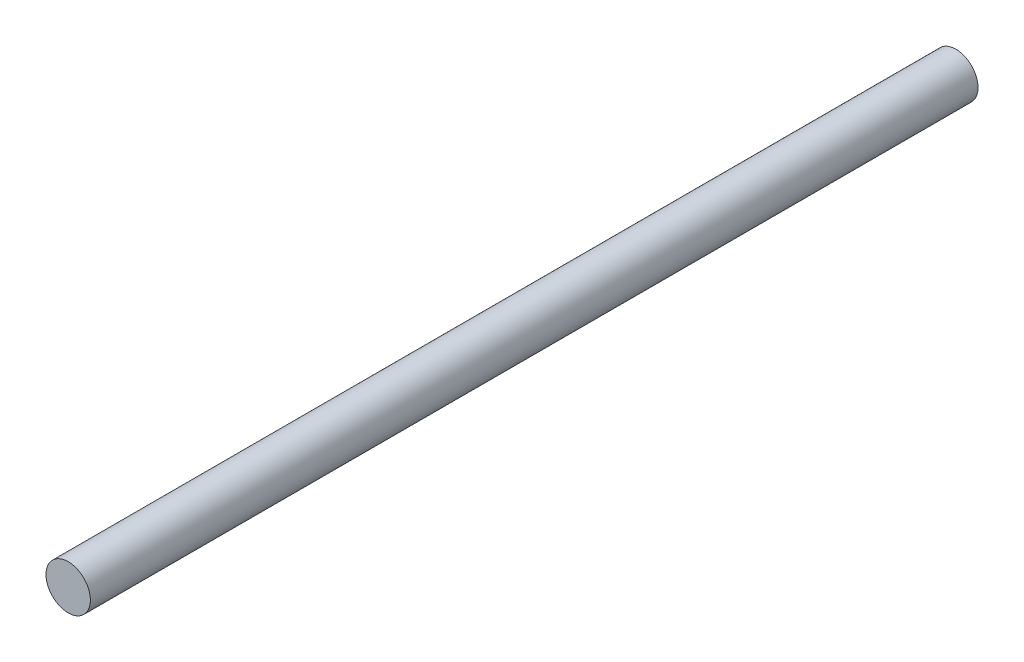
ISO-10303-21;
HEADER;
FILE_DESCRIPTION(('STEP AP214'),'2;1');
FILE_NAME('part.step','',(''),(''),'','','');
FILE_SCHEMA(('AUTOMOTIVE_DESIGN { 1 0 10303 214 1 1 1 1 }'));
ENDSEC;
DATA;
#1=APPLICATION_CONTEXT('core data for automotive mechanical design processes');
#2=APPLICATION_PROTOCOL_DEFINITION('international standard','automotive_design',2000,#1);
#3=PRODUCT_CONTEXT('',#1,'mechanical');
#4=PRODUCT('Part','Part','',(#3));
#5=PRODUCT_RELATED_PRODUCT_CATEGORY('part','',(#4));
#6=PRODUCT_DEFINITION_FORMATION('','',#4);
#7=PRODUCT_DEFINITION_CONTEXT('part definition',#1,'design');
#8=PRODUCT_DEFINITION('design','',#6,#7);
#9=PRODUCT_DEFINITION_SHAPE('','',#8);
#10=(LENGTH_UNIT() NAMED_UNIT(*) SI_UNIT(.MILLI.,.METRE.));
#11=(NAMED_UNIT(*) PLANE_ANGLE_UNIT() SI_UNIT($,.RADIAN.));
#12=(NAMED_UNIT(*) SI_UNIT($,.STERADIAN.) SOLID_ANGLE_UNIT());
#13=UNCERTAINTY_MEASURE_WITH_UNIT(LENGTH_MEASURE(1.E-05),#10,'distance_accuracy_value','');
#14=(GEOMETRIC_REPRESENTATION_CONTEXT(3) GLOBAL_UNCERTAINTY_ASSIGNED_CONTEXT((#13)) GLOBAL_UNIT_ASSIGNED_CONTEXT((#10,
#11,#12)) REPRESENTATION_CONTEXT('',''));
#15=CARTESIAN_POINT('',(0.,0.,0.));
#16=DIRECTION('',(0.,0.,1.));
#17=DIRECTION('',(1.,0.,0.));
#18=AXIS2_PLACEMENT_3D('',#15,#16,#17);
#19=CARTESIAN_POINT('',(0.,0.,76.2));
#20=DIRECTION('',(0.,0.,-1.));
#21=DIRECTION('',(-1.,0.,0.));
#22=AXIS2_PLACEMENT_3D('',#19,#20,#21);
#23=CYLINDRICAL_SURFACE('',#22,1.905);
#24=CARTESIAN_POINT('',(0.,0.,76.2));
#25=DIRECTION('',(0.,0.,1.));
#26=DIRECTION('',(1.,0.,0.));
#27=AXIS2_PLACEMENT_3D('',#24,#25,#26);
#28=CIRCLE('',#27,1.905);
#29=CARTESIAN_POINT('',(-1.905,0.,76.2));
#30=VERTEX_POINT('',#29);
#31=EDGE_CURVE('E10',#30,#30,#28,.T.);
#32=CARTESIAN_POINT('',(0.,0.,0.));
#33=DIRECTION('',(0.,0.,1.));
#34=DIRECTION('',(1.,0.,0.));
#35=AXIS2_PLACEMENT_3D('',#32,#33,#34);
#36=CIRCLE('',#35,1.905);
#37=CARTESIAN_POINT('',(-1.905,0.,0.));
#38=VERTEX_POINT('',#37);
#39=EDGE_CURVE('E38',#38,#38,#36,.T.);
#40=CARTESIAN_POINT('',(-1.905,0.,76.2));
#41=CARTESIAN_POINT('',(-1.905,0.,75.40625));
#42=CARTESIAN_POINT('',(-1.905,0.,74.6125));
#43=CARTESIAN_POINT('',(-1.905,0.,73.025));
#44=CARTESIAN_POINT('',(-1.905,0.,72.23125));
#45=CARTESIAN_POINT('',(-1.905,0.,70.64375));
#46=CARTESIAN_POINT('',(-1.905,0.,69.85));
#47=CARTESIAN_POINT('',(-1.905,0.,68.2625));
#48=CARTESIAN_POINT('',(-1.905,0.,67.46875));
#49=CARTESIAN_POINT('',(-1.905,0.,65.88125));
#50=CARTESIAN_POINT('',(-1.905,0.,65.0875));
#51=CARTESIAN_POINT('',(-1.905,0.,63.5));
#52=CARTESIAN_POINT('',(-1.905,0.,62.70625));
#53=CARTESIAN_POINT('',(-1.905,0.,61.11875));
#54=CARTESIAN_POINT('',(-1.905,0.,60.325));
#55=CARTESIAN_POINT('',(-1.905,0.,58.7375));
#56=CARTESIAN_POINT('',(-1.905,0.,57.94375));
#57=CARTESIAN_POINT('',(-1.905,0.,56.35625));
#58=CARTESIAN_POINT('',(-1.905,0.,55.5625));
#59=CARTESIAN_POINT('',(-1.905,0.,53.975));
#60=CARTESIAN_POINT('',(-1.905,0.,53.18125));
#61=CARTESIAN_POINT('',(-1.905,0.,51.59375));
#62=CARTESIAN_POINT('',(-1.905,0.,50.8));
#63=CARTESIAN_POINT('',(-1.905,0.,49.2125));
#64=CARTESIAN_POINT('',(-1.905,0.,48.41875));
#65=CARTESIAN_POINT('',(-1.905,0.,46.83125));
#66=CARTESIAN_POINT('',(-1.905,0.,46.0375));
#67=CARTESIAN_POINT('',(-1.905,0.,44.45));
#68=CARTESIAN_POINT('',(-1.905,0.,43.65625));
#69=CARTESIAN_POINT('',(-1.905,0.,42.06875));
#70=CARTESIAN_POINT('',(-1.905,0.,41.275));
#71=CARTESIAN_POINT('',(-1.905,0.,39.6875));
#72=CARTESIAN_POINT('',(-1.905,0.,38.89375));
#73=CARTESIAN_POINT('',(-1.905,0.,37.30625));
#74=CARTESIAN_POINT('',(-1.905,0.,36.5125));
#75=CARTESIAN_POINT('',(-1.905,0.,34.925));
#76=CARTESIAN_POINT('',(-1.905,0.,34.13125));
#77=CARTESIAN_POINT('',(-1.905,0.,32.54375));
#78=CARTESIAN_POINT('',(-1.905,0.,31.75));
#79=CARTESIAN_POINT('',(-1.905,0.,30.1625));
#80=CARTESIAN_POINT('',(-1.905,0.,29.36875));
#81=CARTESIAN_POINT('',(-1.905,0.,27.78125));
#82=CARTESIAN_POINT('',(-1.905,0.,26.9875));
#83=CARTESIAN_POINT('',(-1.905,0.,25.4));
#84=CARTESIAN_POINT('',(-1.905,0.,24.60625));
#85=CARTESIAN_POINT('',(-1.905,0.,23.01875));
#86=CARTESIAN_POINT('',(-1.905,0.,22.225));
#87=CARTESIAN_POINT('',(-1.905,0.,20.6375));
#88=CARTESIAN_POINT('',(-1.905,0.,19.84375));
#89=CARTESIAN_POINT('',(-1.905,0.,18.25625));
#90=CARTESIAN_POINT('',(-1.905,0.,17.4625));
#91=CARTESIAN_POINT('',(-1.905,0.,15.875));
#92=CARTESIAN_POINT('',(-1.905,0.,15.08125));
#93=CARTESIAN_POINT('',(-1.905,0.,13.49375));
#94=CARTESIAN_POINT('',(-1.905,0.,12.7));
#95=CARTESIAN_POINT('',(-1.905,0.,11.1125));
#96=CARTESIAN_POINT('',(-1.905,0.,10.31875));
#97=CARTESIAN_POINT('',(-1.905,0.,8.73125));
#98=CARTESIAN_POINT('',(-1.905,0.,7.93750000000001));
#99=CARTESIAN_POINT('',(-1.905,0.,6.35));
#100=CARTESIAN_POINT('',(-1.905,0.,5.55625));
#101=CARTESIAN_POINT('',(-1.905,0.,3.96875));
#102=CARTESIAN_POINT('',(-1.905,0.,3.175));
#103=CARTESIAN_POINT('',(-1.905,0.,1.5875));
#104=CARTESIAN_POINT('',(-1.905,0.,0.793750000000001));
#105=CARTESIAN_POINT('',(-1.905,0.,0.));
#106=B_SPLINE_CURVE_WITH_KNOTS('',3,(#40,#41,#42,#43,#44,#45,#46,#47,#48,#49,#50,#51,#52,#53,
#54,#55,#56,#57,#58,#59,#60,#61,#62,#63,#64,#65,#66,#67,#68,#69,#70,#71,#72,#73,#74,#75,#76,#77,
#78,#79,#80,#81,#82,#83,#84,#85,#86,#87,#88,#89,#90,#91,#92,#93,#94,#95,#96,#97,#98,#99,#100,
#101,#102,#103,#104,#105),.UNSPECIFIED.,.F.,.F.,(4,2,2,2,2,2,2,2,2,2,2,2,2,2,2,2,2,2,2,2,2,2,2,
2,2,2,2,2,2,2,2,2,4),(0.,2.38124999999999,4.76249999999999,7.14374999999999,9.52499999999999,
11.90625,14.2875,16.66875,19.05,21.43125,23.8125,26.19375,28.575,30.95625,33.3375,35.71875,38.1,
40.48125,42.8625,45.24375,47.625,50.00625,52.3875,54.76875,57.15,59.53125,61.9125,64.29375,
66.675,69.05625,71.4375,73.81875,76.2),.UNSPECIFIED.);
#107=EDGE_CURVE('BSEAM35',#30,#38,#106,.T.);
#108=ORIENTED_EDGE('',*,*,#31,.F.);
#109=ORIENTED_EDGE('',*,*,#39,.T.);
#110=ORIENTED_EDGE('',*,*,#107,.T.);
#111=ORIENTED_EDGE('',*,*,#107,.F.);
#112=EDGE_LOOP('',(#108,#110,#109,#111));
#113=FACE_BOUND('',#112,.T.);
#114=ADVANCED_FACE('F35',(#113),#23,.T.);
#115=CARTESIAN_POINT('',(0.,0.,76.2));
#116=DIRECTION('',(0.,0.,1.));
#117=DIRECTION('',(1.,0.,0.));
#118=AXIS2_PLACEMENT_3D('',#115,#116,#117);
#119=PLANE('',#118);
#120=ORIENTED_EDGE('',*,*,#31,.T.);
#121=EDGE_LOOP('',(#120));
#122=FACE_BOUND('',#121,.T.);
#123=ADVANCED_FACE('F51',(#122),#119,.T.);
#124=CARTESIAN_POINT('',(0.,0.,0.));
#125=DIRECTION('',(0.,0.,1.));
#126=DIRECTION('',(1.,0.,0.));
#127=AXIS2_PLACEMENT_3D('',#124,#125,#126);
#128=PLANE('',#127);
#129=ORIENTED_EDGE('',*,*,#39,.F.);
#130=EDGE_LOOP('',(#129));
#131=FACE_BOUND('',#130,.T.);
#132=ADVANCED_FACE('F49',(#131),#128,.F.);
#133=CLOSED_SHELL('',(#114,#123,#132));
#134=MANIFOLD_SOLID_BREP('B2',#133);
#135=ADVANCED_BREP_SHAPE_REPRESENTATION('',(#18,#134),#14);
#136=SHAPE_DEFINITION_REPRESENTATION(#9,#135);
ENDSEC;
END-ISO-10303-21;
